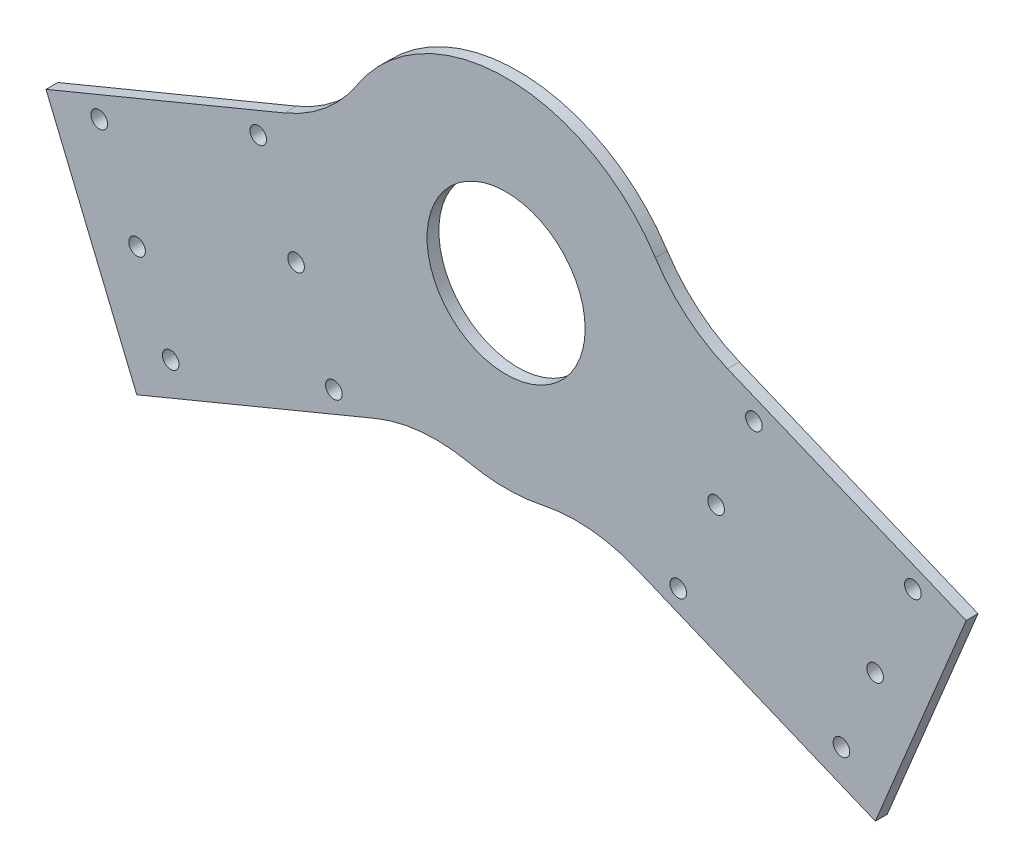
ISO-10303-21;
HEADER;
FILE_DESCRIPTION(('STEP AP214'),'2;1');
FILE_NAME('part.step','',(''),(''),'','','');
FILE_SCHEMA(('AUTOMOTIVE_DESIGN { 1 0 10303 214 1 1 1 1 }'));
ENDSEC;
DATA;
#1=APPLICATION_CONTEXT('core data for automotive mechanical design processes');
#2=APPLICATION_PROTOCOL_DEFINITION('international standard','automotive_design',2000,#1);
#3=PRODUCT_CONTEXT('',#1,'mechanical');
#4=PRODUCT('Part','Part','',(#3));
#5=PRODUCT_RELATED_PRODUCT_CATEGORY('part','',(#4));
#6=PRODUCT_DEFINITION_FORMATION('','',#4);
#7=PRODUCT_DEFINITION_CONTEXT('part definition',#1,'design');
#8=PRODUCT_DEFINITION('design','',#6,#7);
#9=PRODUCT_DEFINITION_SHAPE('','',#8);
#10=(LENGTH_UNIT() NAMED_UNIT(*) SI_UNIT(.MILLI.,.METRE.));
#11=(NAMED_UNIT(*) PLANE_ANGLE_UNIT() SI_UNIT($,.RADIAN.));
#12=(NAMED_UNIT(*) SI_UNIT($,.STERADIAN.) SOLID_ANGLE_UNIT());
#13=UNCERTAINTY_MEASURE_WITH_UNIT(LENGTH_MEASURE(1.E-05),#10,'distance_accuracy_value','');
#14=(GEOMETRIC_REPRESENTATION_CONTEXT(3) GLOBAL_UNCERTAINTY_ASSIGNED_CONTEXT((#13)) GLOBAL_UNIT_ASSIGNED_CONTEXT((#10,
#11,#12)) REPRESENTATION_CONTEXT('',''));
#15=CARTESIAN_POINT('',(0.,0.,0.));
#16=DIRECTION('',(0.,0.,1.));
#17=DIRECTION('',(1.,0.,0.));
#18=AXIS2_PLACEMENT_3D('',#15,#16,#17);
#19=CARTESIAN_POINT('',(0.,0.,3.));
#20=DIRECTION('',(0.,0.,-1.));
#21=DIRECTION('',(-1.,0.,0.));
#22=AXIS2_PLACEMENT_3D('',#19,#20,#21);
#23=CYLINDRICAL_SURFACE('',#22,45.);
#24=CARTESIAN_POINT('',(0.,0.,0.));
#25=DIRECTION('',(0.,0.,1.));
#26=DIRECTION('',(1.,0.,0.));
#27=AXIS2_PLACEMENT_3D('',#24,#25,#26);
#28=CIRCLE('',#27,45.);
#29=CARTESIAN_POINT('',(9.40236221556255,-44.006767488278,0.));
#30=VERTEX_POINT('',#29);
#31=CARTESIAN_POINT('',(-9.40236221556255,-44.006767488278,0.));
#32=VERTEX_POINT('',#31);
#33=EDGE_CURVE('E220',#30,#32,#28,.F.);
#34=ORIENTED_EDGE('',*,*,#33,.F.);
#35=DIRECTION('',(0.,0.,-1.));
#36=VECTOR('',#35,1.);
#37=CARTESIAN_POINT('',(9.40236221556255,-44.006767488278,3.));
#38=LINE('',#37,#36);
#39=CARTESIAN_POINT('',(9.40236221556255,-44.006767488278,3.));
#40=VERTEX_POINT('',#39);
#41=EDGE_CURVE('E271',#30,#40,#38,.F.);
#42=ORIENTED_EDGE('',*,*,#41,.T.);
#43=CARTESIAN_POINT('',(0.,0.,3.));
#44=DIRECTION('',(0.,0.,1.));
#45=DIRECTION('',(1.,0.,0.));
#46=AXIS2_PLACEMENT_3D('',#43,#44,#45);
#47=CIRCLE('',#46,45.);
#48=CARTESIAN_POINT('',(-9.40236221556255,-44.006767488278,3.));
#49=VERTEX_POINT('',#48);
#50=EDGE_CURVE('E162',#40,#49,#47,.F.);
#51=ORIENTED_EDGE('',*,*,#50,.T.);
#52=DIRECTION('',(0.,0.,-1.));
#53=VECTOR('',#52,1.);
#54=CARTESIAN_POINT('',(-9.40236221556255,-44.006767488278,3.));
#55=LINE('',#54,#53);
#56=EDGE_CURVE('E268',#49,#32,#55,.T.);
#57=ORIENTED_EDGE('',*,*,#56,.T.);
#58=EDGE_LOOP('',(#34,#42,#51,#57));
#59=FACE_BOUND('',#58,.T.);
#60=ADVANCED_FACE('F45',(#59),#23,.T.);
#61=CARTESIAN_POINT('',(-11.4805029709528,-27.7163859753385,3.));
#62=DIRECTION('',(-0.382683432365094,-0.923879532511285,0.));
#63=DIRECTION('',(0.923879532511285,-0.382683432365094,0.));
#64=AXIS2_PLACEMENT_3D('',#61,#62,#63);
#65=PLANE('',#64);
#66=DIRECTION('',(-0.923879532511285,0.382683432365094,0.));
#67=VECTOR('',#66,1.);
#68=CARTESIAN_POINT('',(-11.4805029709528,-27.7163859753385,3.));
#69=LINE('',#68,#67);
#70=CARTESIAN_POINT('',(93.4177211956894,-71.1666530940154,3.));
#71=VERTEX_POINT('',#70);
#72=CARTESIAN_POINT('',(33.0673548128886,-46.1687128440737,3.));
#73=VERTEX_POINT('',#72);
#74=EDGE_CURVE('E139',#71,#73,#69,.T.);
#75=ORIENTED_EDGE('',*,*,#74,.T.);
#76=DIRECTION('',(0.,0.,1.));
#77=VECTOR('',#76,1.);
#78=CARTESIAN_POINT('',(33.0673548128886,-46.1687128440737,0.));
#79=LINE('',#78,#77);
#80=CARTESIAN_POINT('',(33.0673548128886,-46.1687128440737,0.));
#81=VERTEX_POINT('',#80);
#82=EDGE_CURVE('E146',#73,#81,#79,.F.);
#83=ORIENTED_EDGE('',*,*,#82,.T.);
#84=DIRECTION('',(-0.923879532511285,0.382683432365094,0.));
#85=VECTOR('',#84,1.);
#86=CARTESIAN_POINT('',(-11.4805029709528,-27.7163859753385,0.));
#87=LINE('',#86,#85);
#88=CARTESIAN_POINT('',(93.4177211956894,-71.1666530940154,0.));
#89=VERTEX_POINT('',#88);
#90=EDGE_CURVE('E142',#89,#81,#87,.T.);
#91=ORIENTED_EDGE('',*,*,#90,.F.);
#92=DIRECTION('',(0.,0.,-1.));
#93=VECTOR('',#92,1.);
#94=CARTESIAN_POINT('',(93.4177211956894,-71.1666530940154,3.));
#95=LINE('',#94,#93);
#96=EDGE_CURVE('E134',#71,#89,#95,.T.);
#97=ORIENTED_EDGE('',*,*,#96,.F.);
#98=EDGE_LOOP('',(#75,#83,#91,#97));
#99=FACE_BOUND('',#98,.T.);
#100=ADVANCED_FACE('F136',(#99),#65,.T.);
#101=CARTESIAN_POINT('',(104.898224166642,-43.4502671186769,3.));
#102=DIRECTION('',(-0.923879532511285,0.382683432365094,0.));
#103=DIRECTION('',(-0.382683432365094,-0.923879532511285,0.));
#104=AXIS2_PLACEMENT_3D('',#101,#102,#103);
#105=PLANE('',#104);
#106=DIRECTION('',(0.382683432365094,0.923879532511285,0.));
#107=VECTOR('',#106,1.);
#108=CARTESIAN_POINT('',(104.898224166642,-43.4502671186769,0.));
#109=LINE('',#108,#107);
#110=CARTESIAN_POINT('',(116.378727137595,-15.7338811433383,0.));
#111=VERTEX_POINT('',#110);
#112=EDGE_CURVE('E224',#89,#111,#109,.T.);
#113=ORIENTED_EDGE('',*,*,#112,.T.);
#114=DIRECTION('',(0.,0.,-1.));
#115=VECTOR('',#114,1.);
#116=CARTESIAN_POINT('',(116.378727137595,-15.7338811433383,3.));
#117=LINE('',#116,#115);
#118=CARTESIAN_POINT('',(116.378727137595,-15.7338811433383,3.));
#119=VERTEX_POINT('',#118);
#120=EDGE_CURVE('E147',#119,#111,#117,.T.);
#121=ORIENTED_EDGE('',*,*,#120,.F.);
#122=DIRECTION('',(0.382683432365094,0.923879532511285,0.));
#123=VECTOR('',#122,1.);
#124=CARTESIAN_POINT('',(104.898224166642,-43.4502671186769,3.));
#125=LINE('',#124,#123);
#126=EDGE_CURVE('E151',#71,#119,#125,.T.);
#127=ORIENTED_EDGE('',*,*,#126,.F.);
#128=ORIENTED_EDGE('',*,*,#96,.T.);
#129=EDGE_LOOP('',(#113,#121,#127,#128));
#130=FACE_BOUND('',#129,.T.);
#131=ADVANCED_FACE('F152',(#130),#105,.F.);
#132=CARTESIAN_POINT('',(11.4805029709528,27.7163859753386,3.));
#133=DIRECTION('',(-0.382683432365094,-0.923879532511285,0.));
#134=DIRECTION('',(0.923879532511285,-0.382683432365094,0.));
#135=AXIS2_PLACEMENT_3D('',#132,#133,#134);
#136=PLANE('',#135);
#137=DIRECTION('',(-0.923879532511285,0.382683432365094,0.));
#138=VECTOR('',#137,1.);
#139=CARTESIAN_POINT('',(11.4805029709528,27.7163859753386,0.));
#140=LINE('',#139,#138);
#141=CARTESIAN_POINT('',(56.0283607547942,9.26405910660339,0.));
#142=VERTEX_POINT('',#141);
#143=EDGE_CURVE('E226',#111,#142,#140,.T.);
#144=ORIENTED_EDGE('',*,*,#143,.T.);
#145=DIRECTION('',(0.,0.,1.));
#146=VECTOR('',#145,1.);
#147=CARTESIAN_POINT('',(56.0283607547942,9.26405910660339,3.));
#148=LINE('',#147,#146);
#149=CARTESIAN_POINT('',(56.0283607547942,9.26405910660339,3.));
#150=VERTEX_POINT('',#149);
#151=EDGE_CURVE('E280',#142,#150,#148,.T.);
#152=ORIENTED_EDGE('',*,*,#151,.T.);
#153=DIRECTION('',(-0.923879532511285,0.382683432365094,0.));
#154=VECTOR('',#153,1.);
#155=CARTESIAN_POINT('',(11.4805029709528,27.7163859753386,3.));
#156=LINE('',#155,#154);
#157=EDGE_CURVE('E155',#119,#150,#156,.T.);
#158=ORIENTED_EDGE('',*,*,#157,.F.);
#159=ORIENTED_EDGE('',*,*,#120,.T.);
#160=EDGE_LOOP('',(#144,#152,#158,#159));
#161=FACE_BOUND('',#160,.T.);
#162=ADVANCED_FACE('F444',(#161),#136,.F.);
#163=CARTESIAN_POINT('',(0.,0.,3.));
#164=DIRECTION('',(0.,0.,-1.));
#165=DIRECTION('',(-1.,0.,0.));
#166=AXIS2_PLACEMENT_3D('',#163,#164,#165);
#167=CYLINDRICAL_SURFACE('',#166,45.);
#168=CARTESIAN_POINT('',(0.,0.,3.));
#169=DIRECTION('',(0.,0.,1.));
#170=DIRECTION('',(1.,0.,0.));
#171=AXIS2_PLACEMENT_3D('',#168,#169,#170);
#172=CIRCLE('',#171,45.);
#173=CARTESIAN_POINT('',(37.7659577908577,24.4690096272643,3.));
#174=VERTEX_POINT('',#173);
#175=CARTESIAN_POINT('',(-37.7659577908577,24.4690096272643,3.));
#176=VERTEX_POINT('',#175);
#177=EDGE_CURVE('E170',#174,#176,#172,.T.);
#178=ORIENTED_EDGE('',*,*,#177,.F.);
#179=DIRECTION('',(0.,0.,-1.));
#180=VECTOR('',#179,1.);
#181=CARTESIAN_POINT('',(37.7659577908577,24.4690096272643,3.));
#182=LINE('',#181,#180);
#183=CARTESIAN_POINT('',(37.7659577908577,24.4690096272643,0.));
#184=VERTEX_POINT('',#183);
#185=EDGE_CURVE('E277',#174,#184,#182,.T.);
#186=ORIENTED_EDGE('',*,*,#185,.T.);
#187=CARTESIAN_POINT('',(0.,0.,0.));
#188=DIRECTION('',(0.,0.,1.));
#189=DIRECTION('',(1.,0.,0.));
#190=AXIS2_PLACEMENT_3D('',#187,#188,#189);
#191=CIRCLE('',#190,45.);
#192=CARTESIAN_POINT('',(-37.7659577908577,24.4690096272643,0.));
#193=VERTEX_POINT('',#192);
#194=EDGE_CURVE('E229',#184,#193,#191,.T.);
#195=ORIENTED_EDGE('',*,*,#194,.T.);
#196=DIRECTION('',(0.,0.,-1.));
#197=VECTOR('',#196,1.);
#198=CARTESIAN_POINT('',(-37.7659577908577,24.4690096272643,3.));
#199=LINE('',#198,#197);
#200=EDGE_CURVE('E275',#193,#176,#199,.F.);
#201=ORIENTED_EDGE('',*,*,#200,.T.);
#202=EDGE_LOOP('',(#178,#186,#195,#201));
#203=FACE_BOUND('',#202,.T.);
#204=ADVANCED_FACE('F301',(#203),#167,.T.);
#205=CARTESIAN_POINT('',(-11.4805029709528,27.7163859753386,3.));
#206=DIRECTION('',(-0.382683432365094,0.923879532511285,0.));
#207=DIRECTION('',(-0.923879532511285,-0.382683432365094,0.));
#208=AXIS2_PLACEMENT_3D('',#205,#206,#207);
#209=PLANE('',#208);
#210=DIRECTION('',(0.923879532511285,0.382683432365094,0.));
#211=VECTOR('',#210,1.);
#212=CARTESIAN_POINT('',(-11.4805029709528,27.7163859753386,3.));
#213=LINE('',#212,#211);
#214=CARTESIAN_POINT('',(-116.378727137595,-15.7338811433383,3.));
#215=VERTEX_POINT('',#214);
#216=CARTESIAN_POINT('',(-56.0283607547942,9.26405910660339,3.));
#217=VERTEX_POINT('',#216);
#218=EDGE_CURVE('E172',#215,#217,#213,.T.);
#219=ORIENTED_EDGE('',*,*,#218,.T.);
#220=DIRECTION('',(0.,0.,-1.));
#221=VECTOR('',#220,1.);
#222=CARTESIAN_POINT('',(-56.0283607547942,9.26405910660339,3.));
#223=LINE('',#222,#221);
#224=CARTESIAN_POINT('',(-56.0283607547942,9.26405910660339,0.));
#225=VERTEX_POINT('',#224);
#226=EDGE_CURVE('E282',#217,#225,#223,.T.);
#227=ORIENTED_EDGE('',*,*,#226,.T.);
#228=DIRECTION('',(0.923879532511285,0.382683432365094,0.));
#229=VECTOR('',#228,1.);
#230=CARTESIAN_POINT('',(-11.4805029709528,27.7163859753386,0.));
#231=LINE('',#230,#229);
#232=CARTESIAN_POINT('',(-116.378727137595,-15.7338811433383,0.));
#233=VERTEX_POINT('',#232);
#234=EDGE_CURVE('E232',#233,#225,#231,.T.);
#235=ORIENTED_EDGE('',*,*,#234,.F.);
#236=DIRECTION('',(0.,0.,-1.));
#237=VECTOR('',#236,1.);
#238=CARTESIAN_POINT('',(-116.378727137595,-15.7338811433383,3.));
#239=LINE('',#238,#237);
#240=EDGE_CURVE('E264',#215,#233,#239,.T.);
#241=ORIENTED_EDGE('',*,*,#240,.F.);
#242=EDGE_LOOP('',(#219,#227,#235,#241));
#243=FACE_BOUND('',#242,.T.);
#244=ADVANCED_FACE('F304',(#243),#209,.T.);
#245=CARTESIAN_POINT('',(-104.898224166642,-43.4502671186769,3.));
#246=DIRECTION('',(-0.923879532511285,-0.382683432365094,0.));
#247=DIRECTION('',(0.382683432365094,-0.923879532511285,0.));
#248=AXIS2_PLACEMENT_3D('',#245,#246,#247);
#249=PLANE('',#248);
#250=DIRECTION('',(-0.382683432365094,0.923879532511285,0.));
#251=VECTOR('',#250,1.);
#252=CARTESIAN_POINT('',(-104.898224166642,-43.4502671186769,0.));
#253=LINE('',#252,#251);
#254=CARTESIAN_POINT('',(-93.4177211956894,-71.1666530940154,0.));
#255=VERTEX_POINT('',#254);
#256=EDGE_CURVE('E235',#255,#233,#253,.T.);
#257=ORIENTED_EDGE('',*,*,#256,.F.);
#258=DIRECTION('',(0.,0.,-1.));
#259=VECTOR('',#258,1.);
#260=CARTESIAN_POINT('',(-93.4177211956894,-71.1666530940154,3.));
#261=LINE('',#260,#259);
#262=CARTESIAN_POINT('',(-93.4177211956894,-71.1666530940154,3.));
#263=VERTEX_POINT('',#262);
#264=EDGE_CURVE('E201',#263,#255,#261,.T.);
#265=ORIENTED_EDGE('',*,*,#264,.F.);
#266=DIRECTION('',(-0.382683432365094,0.923879532511285,0.));
#267=VECTOR('',#266,1.);
#268=CARTESIAN_POINT('',(-104.898224166642,-43.4502671186769,3.));
#269=LINE('',#268,#267);
#270=EDGE_CURVE('E174',#263,#215,#269,.T.);
#271=ORIENTED_EDGE('',*,*,#270,.T.);
#272=ORIENTED_EDGE('',*,*,#240,.T.);
#273=EDGE_LOOP('',(#257,#265,#271,#272));
#274=FACE_BOUND('',#273,.T.);
#275=ADVANCED_FACE('F308',(#274),#249,.T.);
#276=CARTESIAN_POINT('',(43.5569293555824,-45.1016758817191,3.));
#277=DIRECTION('',(0.,0.,-1.));
#278=DIRECTION('',(-1.,0.,0.));
#279=AXIS2_PLACEMENT_3D('',#276,#277,#278);
#280=CYLINDRICAL_SURFACE('',#279,2.1);
#281=CARTESIAN_POINT('',(43.5569293555824,-45.1016758817191,3.));
#282=DIRECTION('',(0.,0.,1.));
#283=DIRECTION('',(1.,0.,0.));
#284=AXIS2_PLACEMENT_3D('',#281,#282,#283);
#285=CIRCLE('',#284,2.1);
#286=CARTESIAN_POINT('',(45.6569293555824,-45.1016758817191,3.));
#287=VERTEX_POINT('',#286);
#288=EDGE_CURVE('E195',#287,#287,#285,.F.);
#289=ORIENTED_EDGE('',*,*,#288,.F.);
#290=EDGE_LOOP('',(#289));
#291=FACE_BOUND('',#290,.T.);
#292=CARTESIAN_POINT('',(43.5569293555824,-45.1016758817191,0.));
#293=DIRECTION('',(0.,0.,1.));
#294=DIRECTION('',(1.,0.,0.));
#295=AXIS2_PLACEMENT_3D('',#292,#293,#294);
#296=CIRCLE('',#295,2.1);
#297=CARTESIAN_POINT('',(45.6569293555824,-45.1016758817191,0.));
#298=VERTEX_POINT('',#297);
#299=EDGE_CURVE('E256',#298,#298,#296,.F.);
#300=ORIENTED_EDGE('',*,*,#299,.T.);
#301=EDGE_LOOP('',(#300));
#302=FACE_BOUND('',#301,.T.);
#303=ADVANCED_FACE('F413',(#291,#302),#280,.F.);
#304=CARTESIAN_POINT('',(-43.5569293555824,-45.1016758817191,3.));
#305=DIRECTION('',(0.,0.,-1.));
#306=DIRECTION('',(-1.,0.,0.));
#307=AXIS2_PLACEMENT_3D('',#304,#305,#306);
#308=CYLINDRICAL_SURFACE('',#307,2.1);
#309=CARTESIAN_POINT('',(-43.5569293555824,-45.1016758817191,3.));
#310=DIRECTION('',(0.,0.,1.));
#311=DIRECTION('',(1.,0.,0.));
#312=AXIS2_PLACEMENT_3D('',#309,#310,#311);
#313=CIRCLE('',#312,2.1);
#314=CARTESIAN_POINT('',(-41.4569293555824,-45.1016758817191,3.));
#315=VERTEX_POINT('',#314);
#316=EDGE_CURVE('E192',#315,#315,#313,.T.);
#317=ORIENTED_EDGE('',*,*,#316,.T.);
#318=EDGE_LOOP('',(#317));
#319=FACE_BOUND('',#318,.T.);
#320=CARTESIAN_POINT('',(-43.5569293555824,-45.1016758817191,0.));
#321=DIRECTION('',(0.,0.,1.));
#322=DIRECTION('',(1.,0.,0.));
#323=AXIS2_PLACEMENT_3D('',#320,#321,#322);
#324=CIRCLE('',#323,2.1);
#325=CARTESIAN_POINT('',(-41.4569293555824,-45.1016758817191,0.));
#326=VERTEX_POINT('',#325);
#327=EDGE_CURVE('E253',#326,#326,#324,.T.);
#328=ORIENTED_EDGE('',*,*,#327,.F.);
#329=EDGE_LOOP('',(#328));
#330=FACE_BOUND('',#329,.T.);
#331=ADVANCED_FACE('F416',(#319,#330),#308,.F.);
#332=CARTESIAN_POINT('',(-53.1240151647098,-22.004687568937,3.));
#333=DIRECTION('',(0.,0.,-1.));
#334=DIRECTION('',(-1.,0.,0.));
#335=AXIS2_PLACEMENT_3D('',#332,#333,#334);
#336=CYLINDRICAL_SURFACE('',#335,2.1);
#337=CARTESIAN_POINT('',(-53.1240151647098,-22.004687568937,3.));
#338=DIRECTION('',(0.,0.,1.));
#339=DIRECTION('',(1.,0.,0.));
#340=AXIS2_PLACEMENT_3D('',#337,#338,#339);
#341=CIRCLE('',#340,2.1);
#342=CARTESIAN_POINT('',(-51.0240151647098,-22.004687568937,3.));
#343=VERTEX_POINT('',#342);
#344=EDGE_CURVE('E189',#343,#343,#341,.T.);
#345=ORIENTED_EDGE('',*,*,#344,.T.);
#346=EDGE_LOOP('',(#345));
#347=FACE_BOUND('',#346,.T.);
#348=CARTESIAN_POINT('',(-53.1240151647098,-22.004687568937,0.));
#349=DIRECTION('',(0.,0.,1.));
#350=DIRECTION('',(1.,0.,0.));
#351=AXIS2_PLACEMENT_3D('',#348,#349,#350);
#352=CIRCLE('',#351,2.1);
#353=CARTESIAN_POINT('',(-51.0240151647098,-22.004687568937,0.));
#354=VERTEX_POINT('',#353);
#355=EDGE_CURVE('E250',#354,#354,#352,.T.);
#356=ORIENTED_EDGE('',*,*,#355,.F.);
#357=EDGE_LOOP('',(#356));
#358=FACE_BOUND('',#357,.T.);
#359=ADVANCED_FACE('F420',(#347,#358),#336,.F.);
#360=CARTESIAN_POINT('',(-62.6911009738371,1.0923007438451,3.));
#361=DIRECTION('',(0.,0.,-1.));
#362=DIRECTION('',(-1.,0.,0.));
#363=AXIS2_PLACEMENT_3D('',#360,#361,#362);
#364=CYLINDRICAL_SURFACE('',#363,2.1);
#365=CARTESIAN_POINT('',(-62.6911009738371,1.0923007438451,3.));
#366=DIRECTION('',(0.,0.,1.));
#367=DIRECTION('',(1.,0.,0.));
#368=AXIS2_PLACEMENT_3D('',#365,#366,#367);
#369=CIRCLE('',#368,2.1);
#370=CARTESIAN_POINT('',(-60.5911009738371,1.0923007438451,3.));
#371=VERTEX_POINT('',#370);
#372=EDGE_CURVE('E186',#371,#371,#369,.T.);
#373=ORIENTED_EDGE('',*,*,#372,.T.);
#374=EDGE_LOOP('',(#373));
#375=FACE_BOUND('',#374,.T.);
#376=CARTESIAN_POINT('',(-62.6911009738371,1.0923007438451,0.));
#377=DIRECTION('',(0.,0.,1.));
#378=DIRECTION('',(1.,0.,0.));
#379=AXIS2_PLACEMENT_3D('',#376,#377,#378);
#380=CIRCLE('',#379,2.1);
#381=CARTESIAN_POINT('',(-60.5911009738371,1.0923007438451,0.));
#382=VERTEX_POINT('',#381);
#383=EDGE_CURVE('E247',#382,#382,#380,.T.);
#384=ORIENTED_EDGE('',*,*,#383,.F.);
#385=EDGE_LOOP('',(#384));
#386=FACE_BOUND('',#385,.T.);
#387=ADVANCED_FACE('F424',(#375,#386),#364,.F.);
#388=CARTESIAN_POINT('',(93.3497300102512,-38.6667242141132,3.));
#389=DIRECTION('',(0.,0.,-1.));
#390=DIRECTION('',(-1.,0.,0.));
#391=AXIS2_PLACEMENT_3D('',#388,#389,#390);
#392=CYLINDRICAL_SURFACE('',#391,2.1);
#393=CARTESIAN_POINT('',(93.3497300102512,-38.6667242141132,3.));
#394=DIRECTION('',(0.,0.,1.));
#395=DIRECTION('',(1.,0.,0.));
#396=AXIS2_PLACEMENT_3D('',#393,#394,#395);
#397=CIRCLE('',#396,2.1);
#398=CARTESIAN_POINT('',(95.4497300102512,-38.6667242141132,3.));
#399=VERTEX_POINT('',#398);
#400=EDGE_CURVE('E183',#399,#399,#397,.F.);
#401=ORIENTED_EDGE('',*,*,#400,.F.);
#402=EDGE_LOOP('',(#401));
#403=FACE_BOUND('',#402,.T.);
#404=CARTESIAN_POINT('',(93.3497300102512,-38.6667242141132,0.));
#405=DIRECTION('',(0.,0.,1.));
#406=DIRECTION('',(1.,0.,0.));
#407=AXIS2_PLACEMENT_3D('',#404,#405,#406);
#408=CIRCLE('',#407,2.1);
#409=CARTESIAN_POINT('',(95.4497300102512,-38.6667242141132,0.));
#410=VERTEX_POINT('',#409);
#411=EDGE_CURVE('E244',#410,#410,#408,.F.);
#412=ORIENTED_EDGE('',*,*,#411,.T.);
#413=EDGE_LOOP('',(#412));
#414=FACE_BOUND('',#413,.T.);
#415=ADVANCED_FACE('F428',(#403,#414),#392,.F.);
#416=CARTESIAN_POINT('',(0.,0.,3.));
#417=DIRECTION('',(0.,0.,-1.));
#418=DIRECTION('',(-1.,0.,0.));
#419=AXIS2_PLACEMENT_3D('',#416,#417,#418);
#420=CYLINDRICAL_SURFACE('',#419,20.);
#421=CARTESIAN_POINT('',(0.,0.,3.));
#422=DIRECTION('',(0.,0.,1.));
#423=DIRECTION('',(1.,0.,0.));
#424=AXIS2_PLACEMENT_3D('',#421,#422,#423);
#425=CIRCLE('',#424,20.);
#426=CARTESIAN_POINT('',(20.,0.,3.));
#427=VERTEX_POINT('',#426);
#428=EDGE_CURVE('E180',#427,#427,#425,.T.);
#429=ORIENTED_EDGE('',*,*,#428,.T.);
#430=EDGE_LOOP('',(#429));
#431=FACE_BOUND('',#430,.T.);
#432=CARTESIAN_POINT('',(0.,0.,0.));
#433=DIRECTION('',(0.,0.,1.));
#434=DIRECTION('',(1.,0.,0.));
#435=AXIS2_PLACEMENT_3D('',#432,#433,#434);
#436=CIRCLE('',#435,20.);
#437=CARTESIAN_POINT('',(20.,0.,0.));
#438=VERTEX_POINT('',#437);
#439=EDGE_CURVE('E241',#438,#438,#436,.T.);
#440=ORIENTED_EDGE('',*,*,#439,.F.);
#441=EDGE_LOOP('',(#440));
#442=FACE_BOUND('',#441,.T.);
#443=ADVANCED_FACE('F432',(#431,#442),#420,.F.);
#444=CARTESIAN_POINT('',(11.4805029709528,-27.7163859753385,3.));
#445=DIRECTION('',(-0.382683432365094,0.923879532511285,0.));
#446=DIRECTION('',(-0.923879532511285,-0.382683432365094,0.));
#447=AXIS2_PLACEMENT_3D('',#444,#445,#446);
#448=PLANE('',#447);
#449=DIRECTION('',(0.923879532511285,0.382683432365094,0.));
#450=VECTOR('',#449,1.);
#451=CARTESIAN_POINT('',(11.4805029709528,-27.7163859753385,0.));
#452=LINE('',#451,#450);
#453=CARTESIAN_POINT('',(-33.0673548128886,-46.1687128440737,0.));
#454=VERTEX_POINT('',#453);
#455=EDGE_CURVE('E238',#255,#454,#452,.T.);
#456=ORIENTED_EDGE('',*,*,#455,.T.);
#457=DIRECTION('',(0.,0.,-1.));
#458=VECTOR('',#457,1.);
#459=CARTESIAN_POINT('',(-33.0673548128886,-46.1687128440737,3.));
#460=LINE('',#459,#458);
#461=CARTESIAN_POINT('',(-33.0673548128886,-46.1687128440737,3.));
#462=VERTEX_POINT('',#461);
#463=EDGE_CURVE('E273',#454,#462,#460,.F.);
#464=ORIENTED_EDGE('',*,*,#463,.T.);
#465=DIRECTION('',(0.923879532511285,0.382683432365094,0.));
#466=VECTOR('',#465,1.);
#467=CARTESIAN_POINT('',(11.4805029709528,-27.7163859753385,3.));
#468=LINE('',#467,#466);
#469=EDGE_CURVE('E177',#263,#462,#468,.T.);
#470=ORIENTED_EDGE('',*,*,#469,.F.);
#471=ORIENTED_EDGE('',*,*,#264,.T.);
#472=EDGE_LOOP('',(#456,#464,#470,#471));
#473=FACE_BOUND('',#472,.T.);
#474=ADVANCED_FACE('F312',(#473),#448,.F.);
#475=CARTESIAN_POINT('',(-93.3497300102512,-38.6667242141132,3.));
#476=DIRECTION('',(0.,0.,-1.));
#477=DIRECTION('',(-1.,0.,0.));
#478=AXIS2_PLACEMENT_3D('',#475,#476,#477);
#479=CYLINDRICAL_SURFACE('',#478,2.1);
#480=CARTESIAN_POINT('',(-93.3497300102512,-38.6667242141132,3.));
#481=DIRECTION('',(0.,0.,1.));
#482=DIRECTION('',(1.,0.,0.));
#483=AXIS2_PLACEMENT_3D('',#480,#481,#482);
#484=CIRCLE('',#483,2.1);
#485=CARTESIAN_POINT('',(-91.2497300102511,-38.6667242141132,3.));
#486=VERTEX_POINT('',#485);
#487=EDGE_CURVE('E165',#486,#486,#484,.T.);
#488=ORIENTED_EDGE('',*,*,#487,.T.);
#489=EDGE_LOOP('',(#488));
#490=FACE_BOUND('',#489,.T.);
#491=CARTESIAN_POINT('',(-93.3497300102512,-38.6667242141132,0.));
#492=DIRECTION('',(0.,0.,1.));
#493=DIRECTION('',(1.,0.,0.));
#494=AXIS2_PLACEMENT_3D('',#491,#492,#493);
#495=CIRCLE('',#494,2.1);
#496=CARTESIAN_POINT('',(-91.2497300102511,-38.6667242141132,0.));
#497=VERTEX_POINT('',#496);
#498=EDGE_CURVE('E217',#497,#497,#495,.T.);
#499=ORIENTED_EDGE('',*,*,#498,.F.);
#500=EDGE_LOOP('',(#499));
#501=FACE_BOUND('',#500,.T.);
#502=ADVANCED_FACE('F343',(#490,#501),#479,.F.);
#503=CARTESIAN_POINT('',(-102.916815819378,-15.5697359013311,3.));
#504=DIRECTION('',(0.,0.,-1.));
#505=DIRECTION('',(-1.,0.,0.));
#506=AXIS2_PLACEMENT_3D('',#503,#504,#505);
#507=CYLINDRICAL_SURFACE('',#506,2.1);
#508=CARTESIAN_POINT('',(-102.916815819378,-15.5697359013311,3.));
#509=DIRECTION('',(0.,0.,1.));
#510=DIRECTION('',(1.,0.,0.));
#511=AXIS2_PLACEMENT_3D('',#508,#509,#510);
#512=CIRCLE('',#511,2.1);
#513=CARTESIAN_POINT('',(-100.816815819378,-15.5697359013311,3.));
#514=VERTEX_POINT('',#513);
#515=EDGE_CURVE('E401',#514,#514,#512,.T.);
#516=ORIENTED_EDGE('',*,*,#515,.T.);
#517=EDGE_LOOP('',(#516));
#518=FACE_BOUND('',#517,.T.);
#519=CARTESIAN_POINT('',(-102.916815819378,-15.5697359013311,0.));
#520=DIRECTION('',(0.,0.,1.));
#521=DIRECTION('',(1.,0.,0.));
#522=AXIS2_PLACEMENT_3D('',#519,#520,#521);
#523=CIRCLE('',#522,2.1);
#524=CARTESIAN_POINT('',(-100.816815819378,-15.5697359013311,0.));
#525=VERTEX_POINT('',#524);
#526=EDGE_CURVE('E214',#525,#525,#523,.T.);
#527=ORIENTED_EDGE('',*,*,#526,.F.);
#528=EDGE_LOOP('',(#527));
#529=FACE_BOUND('',#528,.T.);
#530=ADVANCED_FACE('F346',(#518,#529),#507,.F.);
#531=CARTESIAN_POINT('',(-84.838757104316,-59.2140304326114,3.));
#532=DIRECTION('',(0.,0.,-1.));
#533=DIRECTION('',(-1.,0.,0.));
#534=AXIS2_PLACEMENT_3D('',#531,#532,#533);
#535=CYLINDRICAL_SURFACE('',#534,2.1);
#536=CARTESIAN_POINT('',(-84.838757104316,-59.2140304326114,3.));
#537=DIRECTION('',(0.,0.,1.));
#538=DIRECTION('',(1.,0.,0.));
#539=AXIS2_PLACEMENT_3D('',#536,#537,#538);
#540=CIRCLE('',#539,2.1);
#541=CARTESIAN_POINT('',(-82.738757104316,-59.2140304326114,3.));
#542=VERTEX_POINT('',#541);
#543=EDGE_CURVE('E398',#542,#542,#540,.T.);
#544=ORIENTED_EDGE('',*,*,#543,.T.);
#545=EDGE_LOOP('',(#544));
#546=FACE_BOUND('',#545,.T.);
#547=CARTESIAN_POINT('',(-84.838757104316,-59.2140304326114,0.));
#548=DIRECTION('',(0.,0.,1.));
#549=DIRECTION('',(1.,0.,0.));
#550=AXIS2_PLACEMENT_3D('',#547,#548,#549);
#551=CIRCLE('',#550,2.1);
#552=CARTESIAN_POINT('',(-82.738757104316,-59.2140304326114,0.));
#553=VERTEX_POINT('',#552);
#554=EDGE_CURVE('E211',#553,#553,#551,.T.);
#555=ORIENTED_EDGE('',*,*,#554,.F.);
#556=EDGE_LOOP('',(#555));
#557=FACE_BOUND('',#556,.T.);
#558=ADVANCED_FACE('F350',(#546,#557),#535,.F.);
#559=CARTESIAN_POINT('',(84.838757104316,-59.2140304326114,3.));
#560=DIRECTION('',(0.,0.,-1.));
#561=DIRECTION('',(-1.,0.,0.));
#562=AXIS2_PLACEMENT_3D('',#559,#560,#561);
#563=CYLINDRICAL_SURFACE('',#562,2.1);
#564=CARTESIAN_POINT('',(84.838757104316,-59.2140304326114,3.));
#565=DIRECTION('',(0.,0.,1.));
#566=DIRECTION('',(1.,0.,0.));
#567=AXIS2_PLACEMENT_3D('',#564,#565,#566);
#568=CIRCLE('',#567,2.1);
#569=CARTESIAN_POINT('',(86.9387571043161,-59.2140304326114,3.));
#570=VERTEX_POINT('',#569);
#571=EDGE_CURVE('E393',#570,#570,#568,.F.);
#572=ORIENTED_EDGE('',*,*,#571,.F.);
#573=EDGE_LOOP('',(#572));
#574=FACE_BOUND('',#573,.T.);
#575=CARTESIAN_POINT('',(84.838757104316,-59.2140304326114,0.));
#576=DIRECTION('',(0.,0.,1.));
#577=DIRECTION('',(1.,0.,0.));
#578=AXIS2_PLACEMENT_3D('',#575,#576,#577);
#579=CIRCLE('',#578,2.1);
#580=CARTESIAN_POINT('',(86.9387571043161,-59.2140304326114,0.));
#581=VERTEX_POINT('',#580);
#582=EDGE_CURVE('E208',#581,#581,#579,.F.);
#583=ORIENTED_EDGE('',*,*,#582,.T.);
#584=EDGE_LOOP('',(#583));
#585=FACE_BOUND('',#584,.T.);
#586=ADVANCED_FACE('F354',(#574,#585),#563,.F.);
#587=CARTESIAN_POINT('',(102.916815819378,-15.5697359013311,3.));
#588=DIRECTION('',(0.,0.,-1.));
#589=DIRECTION('',(-1.,0.,0.));
#590=AXIS2_PLACEMENT_3D('',#587,#588,#589);
#591=CYLINDRICAL_SURFACE('',#590,2.1);
#592=CARTESIAN_POINT('',(102.916815819378,-15.5697359013311,3.));
#593=DIRECTION('',(0.,0.,1.));
#594=DIRECTION('',(1.,0.,0.));
#595=AXIS2_PLACEMENT_3D('',#592,#593,#594);
#596=CIRCLE('',#595,2.1);
#597=CARTESIAN_POINT('',(105.016815819378,-15.5697359013311,3.));
#598=VERTEX_POINT('',#597);
#599=EDGE_CURVE('E390',#598,#598,#596,.F.);
#600=ORIENTED_EDGE('',*,*,#599,.F.);
#601=EDGE_LOOP('',(#600));
#602=FACE_BOUND('',#601,.T.);
#603=CARTESIAN_POINT('',(102.916815819378,-15.5697359013311,0.));
#604=DIRECTION('',(0.,0.,1.));
#605=DIRECTION('',(1.,0.,0.));
#606=AXIS2_PLACEMENT_3D('',#603,#604,#605);
#607=CIRCLE('',#606,2.1);
#608=CARTESIAN_POINT('',(105.016815819378,-15.5697359013311,0.));
#609=VERTEX_POINT('',#608);
#610=EDGE_CURVE('E205',#609,#609,#607,.F.);
#611=ORIENTED_EDGE('',*,*,#610,.T.);
#612=EDGE_LOOP('',(#611));
#613=FACE_BOUND('',#612,.T.);
#614=ADVANCED_FACE('F358',(#602,#613),#591,.F.);
#615=CARTESIAN_POINT('',(53.1240151647098,-22.004687568937,3.));
#616=DIRECTION('',(0.,0.,-1.));
#617=DIRECTION('',(-1.,0.,0.));
#618=AXIS2_PLACEMENT_3D('',#615,#616,#617);
#619=CYLINDRICAL_SURFACE('',#618,2.1);
#620=CARTESIAN_POINT('',(53.1240151647098,-22.004687568937,3.));
#621=DIRECTION('',(0.,0.,1.));
#622=DIRECTION('',(1.,0.,0.));
#623=AXIS2_PLACEMENT_3D('',#620,#621,#622);
#624=CIRCLE('',#623,2.1);
#625=CARTESIAN_POINT('',(55.2240151647098,-22.004687568937,3.));
#626=VERTEX_POINT('',#625);
#627=EDGE_CURVE('E262',#626,#626,#624,.F.);
#628=ORIENTED_EDGE('',*,*,#627,.F.);
#629=EDGE_LOOP('',(#628));
#630=FACE_BOUND('',#629,.T.);
#631=CARTESIAN_POINT('',(53.1240151647098,-22.004687568937,0.));
#632=DIRECTION('',(0.,0.,1.));
#633=DIRECTION('',(1.,0.,0.));
#634=AXIS2_PLACEMENT_3D('',#631,#632,#633);
#635=CIRCLE('',#634,2.1);
#636=CARTESIAN_POINT('',(55.2240151647098,-22.004687568937,0.));
#637=VERTEX_POINT('',#636);
#638=EDGE_CURVE('E202',#637,#637,#635,.F.);
#639=ORIENTED_EDGE('',*,*,#638,.T.);
#640=EDGE_LOOP('',(#639));
#641=FACE_BOUND('',#640,.T.);
#642=ADVANCED_FACE('F361',(#630,#641),#619,.F.);
#643=CARTESIAN_POINT('',(62.6911009738371,1.0923007438451,3.));
#644=DIRECTION('',(0.,0.,-1.));
#645=DIRECTION('',(-1.,0.,0.));
#646=AXIS2_PLACEMENT_3D('',#643,#644,#645);
#647=CYLINDRICAL_SURFACE('',#646,2.1);
#648=CARTESIAN_POINT('',(62.6911009738371,1.0923007438451,3.));
#649=DIRECTION('',(0.,0.,1.));
#650=DIRECTION('',(1.,0.,0.));
#651=AXIS2_PLACEMENT_3D('',#648,#649,#650);
#652=CIRCLE('',#651,2.1);
#653=CARTESIAN_POINT('',(64.7911009738371,1.0923007438451,3.));
#654=VERTEX_POINT('',#653);
#655=EDGE_CURVE('E198',#654,#654,#652,.F.);
#656=ORIENTED_EDGE('',*,*,#655,.F.);
#657=EDGE_LOOP('',(#656));
#658=FACE_BOUND('',#657,.T.);
#659=CARTESIAN_POINT('',(62.6911009738371,1.0923007438451,0.));
#660=DIRECTION('',(0.,0.,1.));
#661=DIRECTION('',(1.,0.,0.));
#662=AXIS2_PLACEMENT_3D('',#659,#660,#661);
#663=CIRCLE('',#662,2.1);
#664=CARTESIAN_POINT('',(64.7911009738371,1.0923007438451,0.));
#665=VERTEX_POINT('',#664);
#666=EDGE_CURVE('E259',#665,#665,#663,.F.);
#667=ORIENTED_EDGE('',*,*,#666,.T.);
#668=EDGE_LOOP('',(#667));
#669=FACE_BOUND('',#668,.T.);
#670=ADVANCED_FACE('F364',(#658,#669),#647,.F.);
#671=CARTESIAN_POINT('',(0.,0.,3.));
#672=DIRECTION('',(0.,0.,1.));
#673=DIRECTION('',(1.,0.,0.));
#674=AXIS2_PLACEMENT_3D('',#671,#672,#673);
#675=PLANE('',#674);
#676=ORIENTED_EDGE('',*,*,#627,.T.);
#677=EDGE_LOOP('',(#676));
#678=FACE_BOUND('',#677,.T.);
#679=ORIENTED_EDGE('',*,*,#599,.T.);
#680=EDGE_LOOP('',(#679));
#681=FACE_BOUND('',#680,.T.);
#682=ORIENTED_EDGE('',*,*,#571,.T.);
#683=EDGE_LOOP('',(#682));
#684=FACE_BOUND('',#683,.T.);
#685=ORIENTED_EDGE('',*,*,#543,.F.);
#686=EDGE_LOOP('',(#685));
#687=FACE_BOUND('',#686,.T.);
#688=ORIENTED_EDGE('',*,*,#515,.F.);
#689=EDGE_LOOP('',(#688));
#690=FACE_BOUND('',#689,.T.);
#691=ORIENTED_EDGE('',*,*,#487,.F.);
#692=EDGE_LOOP('',(#691));
#693=FACE_BOUND('',#692,.T.);
#694=ORIENTED_EDGE('',*,*,#50,.F.);
#695=CARTESIAN_POINT('',(17.7600175182848,-83.1238941445251,3.));
#696=DIRECTION('',(0.,0.,1.));
#697=DIRECTION('',(1.,0.,0.));
#698=AXIS2_PLACEMENT_3D('',#695,#696,#697);
#699=CIRCLE('',#698,40.);
#700=EDGE_CURVE('E161',#40,#73,#699,.F.);
#701=ORIENTED_EDGE('',*,*,#700,.T.);
#702=ORIENTED_EDGE('',*,*,#74,.F.);
#703=ORIENTED_EDGE('',*,*,#126,.T.);
#704=ORIENTED_EDGE('',*,*,#157,.T.);
#705=CARTESIAN_POINT('',(71.3356980493979,46.2192404070548,3.));
#706=DIRECTION('',(0.,0.,1.));
#707=DIRECTION('',(1.,0.,0.));
#708=AXIS2_PLACEMENT_3D('',#705,#706,#707);
#709=CIRCLE('',#708,40.);
#710=EDGE_CURVE('E293',#150,#174,#709,.F.);
#711=ORIENTED_EDGE('',*,*,#710,.T.);
#712=ORIENTED_EDGE('',*,*,#177,.T.);
#713=CARTESIAN_POINT('',(-71.3356980493979,46.2192404070548,3.));
#714=DIRECTION('',(0.,0.,1.));
#715=DIRECTION('',(1.,0.,0.));
#716=AXIS2_PLACEMENT_3D('',#713,#714,#715);
#717=CIRCLE('',#716,40.);
#718=EDGE_CURVE('E11',#176,#217,#717,.F.);
#719=ORIENTED_EDGE('',*,*,#718,.T.);
#720=ORIENTED_EDGE('',*,*,#218,.F.);
#721=ORIENTED_EDGE('',*,*,#270,.F.);
#722=ORIENTED_EDGE('',*,*,#469,.T.);
#723=CARTESIAN_POINT('',(-17.7600175182848,-83.1238941445251,3.));
#724=DIRECTION('',(0.,0.,1.));
#725=DIRECTION('',(1.,0.,0.));
#726=AXIS2_PLACEMENT_3D('',#723,#724,#725);
#727=CIRCLE('',#726,40.);
#728=EDGE_CURVE('E289',#462,#49,#727,.F.);
#729=ORIENTED_EDGE('',*,*,#728,.T.);
#730=EDGE_LOOP('',(#694,#701,#702,#703,#704,#711,#712,#719,#720,#721,#722,#729));
#731=FACE_BOUND('',#730,.T.);
#732=ORIENTED_EDGE('',*,*,#428,.F.);
#733=EDGE_LOOP('',(#732));
#734=FACE_BOUND('',#733,.T.);
#735=ORIENTED_EDGE('',*,*,#400,.T.);
#736=EDGE_LOOP('',(#735));
#737=FACE_BOUND('',#736,.T.);
#738=ORIENTED_EDGE('',*,*,#372,.F.);
#739=EDGE_LOOP('',(#738));
#740=FACE_BOUND('',#739,.T.);
#741=ORIENTED_EDGE('',*,*,#344,.F.);
#742=EDGE_LOOP('',(#741));
#743=FACE_BOUND('',#742,.T.);
#744=ORIENTED_EDGE('',*,*,#316,.F.);
#745=EDGE_LOOP('',(#744));
#746=FACE_BOUND('',#745,.T.);
#747=ORIENTED_EDGE('',*,*,#288,.T.);
#748=EDGE_LOOP('',(#747));
#749=FACE_BOUND('',#748,.T.);
#750=ORIENTED_EDGE('',*,*,#655,.T.);
#751=EDGE_LOOP('',(#750));
#752=FACE_BOUND('',#751,.T.);
#753=ADVANCED_FACE('F158',(#678,#681,#684,#687,#690,#693,#731,#734,#737,#740,#743,#746,#749,
#752),#675,.T.);
#754=CARTESIAN_POINT('',(0.,0.,0.));
#755=DIRECTION('',(0.,0.,1.));
#756=DIRECTION('',(1.,0.,0.));
#757=AXIS2_PLACEMENT_3D('',#754,#755,#756);
#758=PLANE('',#757);
#759=ORIENTED_EDGE('',*,*,#638,.F.);
#760=EDGE_LOOP('',(#759));
#761=FACE_BOUND('',#760,.T.);
#762=ORIENTED_EDGE('',*,*,#610,.F.);
#763=EDGE_LOOP('',(#762));
#764=FACE_BOUND('',#763,.T.);
#765=ORIENTED_EDGE('',*,*,#582,.F.);
#766=EDGE_LOOP('',(#765));
#767=FACE_BOUND('',#766,.T.);
#768=ORIENTED_EDGE('',*,*,#554,.T.);
#769=EDGE_LOOP('',(#768));
#770=FACE_BOUND('',#769,.T.);
#771=ORIENTED_EDGE('',*,*,#526,.T.);
#772=EDGE_LOOP('',(#771));
#773=FACE_BOUND('',#772,.T.);
#774=ORIENTED_EDGE('',*,*,#498,.T.);
#775=EDGE_LOOP('',(#774));
#776=FACE_BOUND('',#775,.T.);
#777=ORIENTED_EDGE('',*,*,#90,.T.);
#778=CARTESIAN_POINT('',(17.7600175182848,-83.1238941445251,0.));
#779=DIRECTION('',(0.,0.,1.));
#780=DIRECTION('',(1.,0.,0.));
#781=AXIS2_PLACEMENT_3D('',#778,#779,#780);
#782=CIRCLE('',#781,40.);
#783=EDGE_CURVE('E284',#81,#30,#782,.T.);
#784=ORIENTED_EDGE('',*,*,#783,.T.);
#785=ORIENTED_EDGE('',*,*,#33,.T.);
#786=CARTESIAN_POINT('',(-17.7600175182848,-83.1238941445251,0.));
#787=DIRECTION('',(0.,0.,1.));
#788=DIRECTION('',(1.,0.,0.));
#789=AXIS2_PLACEMENT_3D('',#786,#787,#788);
#790=CIRCLE('',#789,40.);
#791=EDGE_CURVE('E287',#32,#454,#790,.T.);
#792=ORIENTED_EDGE('',*,*,#791,.T.);
#793=ORIENTED_EDGE('',*,*,#455,.F.);
#794=ORIENTED_EDGE('',*,*,#256,.T.);
#795=ORIENTED_EDGE('',*,*,#234,.T.);
#796=CARTESIAN_POINT('',(-71.3356980493979,46.2192404070548,0.));
#797=DIRECTION('',(0.,0.,1.));
#798=DIRECTION('',(1.,0.,0.));
#799=AXIS2_PLACEMENT_3D('',#796,#797,#798);
#800=CIRCLE('',#799,40.);
#801=EDGE_CURVE('E53',#225,#193,#800,.T.);
#802=ORIENTED_EDGE('',*,*,#801,.T.);
#803=ORIENTED_EDGE('',*,*,#194,.F.);
#804=CARTESIAN_POINT('',(71.3356980493979,46.2192404070548,0.));
#805=DIRECTION('',(0.,0.,1.));
#806=DIRECTION('',(1.,0.,0.));
#807=AXIS2_PLACEMENT_3D('',#804,#805,#806);
#808=CIRCLE('',#807,40.);
#809=EDGE_CURVE('E291',#184,#142,#808,.T.);
#810=ORIENTED_EDGE('',*,*,#809,.T.);
#811=ORIENTED_EDGE('',*,*,#143,.F.);
#812=ORIENTED_EDGE('',*,*,#112,.F.);
#813=EDGE_LOOP('',(#777,#784,#785,#792,#793,#794,#795,#802,#803,#810,#811,#812));
#814=FACE_BOUND('',#813,.T.);
#815=ORIENTED_EDGE('',*,*,#439,.T.);
#816=EDGE_LOOP('',(#815));
#817=FACE_BOUND('',#816,.T.);
#818=ORIENTED_EDGE('',*,*,#411,.F.);
#819=EDGE_LOOP('',(#818));
#820=FACE_BOUND('',#819,.T.);
#821=ORIENTED_EDGE('',*,*,#383,.T.);
#822=EDGE_LOOP('',(#821));
#823=FACE_BOUND('',#822,.T.);
#824=ORIENTED_EDGE('',*,*,#355,.T.);
#825=EDGE_LOOP('',(#824));
#826=FACE_BOUND('',#825,.T.);
#827=ORIENTED_EDGE('',*,*,#327,.T.);
#828=EDGE_LOOP('',(#827));
#829=FACE_BOUND('',#828,.T.);
#830=ORIENTED_EDGE('',*,*,#299,.F.);
#831=EDGE_LOOP('',(#830));
#832=FACE_BOUND('',#831,.T.);
#833=ORIENTED_EDGE('',*,*,#666,.F.);
#834=EDGE_LOOP('',(#833));
#835=FACE_BOUND('',#834,.T.);
#836=ADVANCED_FACE('F296',(#761,#764,#767,#770,#773,#776,#814,#817,#820,#823,#826,#829,#832,
#835),#758,.F.);
#837=CARTESIAN_POINT('',(17.7600175182848,-83.1238941445251,3.));
#838=DIRECTION('',(0.,0.,-1.));
#839=DIRECTION('',(-1.,0.,0.));
#840=AXIS2_PLACEMENT_3D('',#837,#838,#839);
#841=CYLINDRICAL_SURFACE('',#840,40.);
#842=ORIENTED_EDGE('',*,*,#700,.F.);
#843=ORIENTED_EDGE('',*,*,#41,.F.);
#844=ORIENTED_EDGE('',*,*,#783,.F.);
#845=ORIENTED_EDGE('',*,*,#82,.F.);
#846=EDGE_LOOP('',(#842,#843,#844,#845));
#847=FACE_BOUND('',#846,.T.);
#848=ADVANCED_FACE('F322',(#847),#841,.F.);
#849=CARTESIAN_POINT('',(-17.7600175182848,-83.1238941445251,3.));
#850=DIRECTION('',(0.,0.,-1.));
#851=DIRECTION('',(-1.,0.,0.));
#852=AXIS2_PLACEMENT_3D('',#849,#850,#851);
#853=CYLINDRICAL_SURFACE('',#852,40.);
#854=ORIENTED_EDGE('',*,*,#728,.F.);
#855=ORIENTED_EDGE('',*,*,#463,.F.);
#856=ORIENTED_EDGE('',*,*,#791,.F.);
#857=ORIENTED_EDGE('',*,*,#56,.F.);
#858=EDGE_LOOP('',(#854,#855,#856,#857));
#859=FACE_BOUND('',#858,.T.);
#860=ADVANCED_FACE('F317',(#859),#853,.F.);
#861=CARTESIAN_POINT('',(71.3356980493979,46.2192404070548,3.));
#862=DIRECTION('',(0.,0.,-1.));
#863=DIRECTION('',(-1.,0.,0.));
#864=AXIS2_PLACEMENT_3D('',#861,#862,#863);
#865=CYLINDRICAL_SURFACE('',#864,40.);
#866=ORIENTED_EDGE('',*,*,#710,.F.);
#867=ORIENTED_EDGE('',*,*,#151,.F.);
#868=ORIENTED_EDGE('',*,*,#809,.F.);
#869=ORIENTED_EDGE('',*,*,#185,.F.);
#870=EDGE_LOOP('',(#866,#867,#868,#869));
#871=FACE_BOUND('',#870,.T.);
#872=ADVANCED_FACE('F329',(#871),#865,.F.);
#873=CARTESIAN_POINT('',(-71.3356980493979,46.2192404070548,3.));
#874=DIRECTION('',(0.,0.,-1.));
#875=DIRECTION('',(-1.,0.,0.));
#876=AXIS2_PLACEMENT_3D('',#873,#874,#875);
#877=CYLINDRICAL_SURFACE('',#876,40.);
#878=ORIENTED_EDGE('',*,*,#718,.F.);
#879=ORIENTED_EDGE('',*,*,#200,.F.);
#880=ORIENTED_EDGE('',*,*,#801,.F.);
#881=ORIENTED_EDGE('',*,*,#226,.F.);
#882=EDGE_LOOP('',(#878,#879,#880,#881));
#883=FACE_BOUND('',#882,.T.);
#884=ADVANCED_FACE('F47',(#883),#877,.F.);
#885=CLOSED_SHELL('',(#60,#100,#131,#162,#204,#244,#275,#303,#331,#359,#387,#415,#443,#474,#502,
#530,#558,#586,#614,#642,#670,#753,#836,#848,#860,#872,#884));
#886=MANIFOLD_SOLID_BREP('B2',#885);
#887=ADVANCED_BREP_SHAPE_REPRESENTATION('',(#18,#886),#14);
#888=SHAPE_DEFINITION_REPRESENTATION(#9,#887);
ENDSEC;
END-ISO-10303-21;
